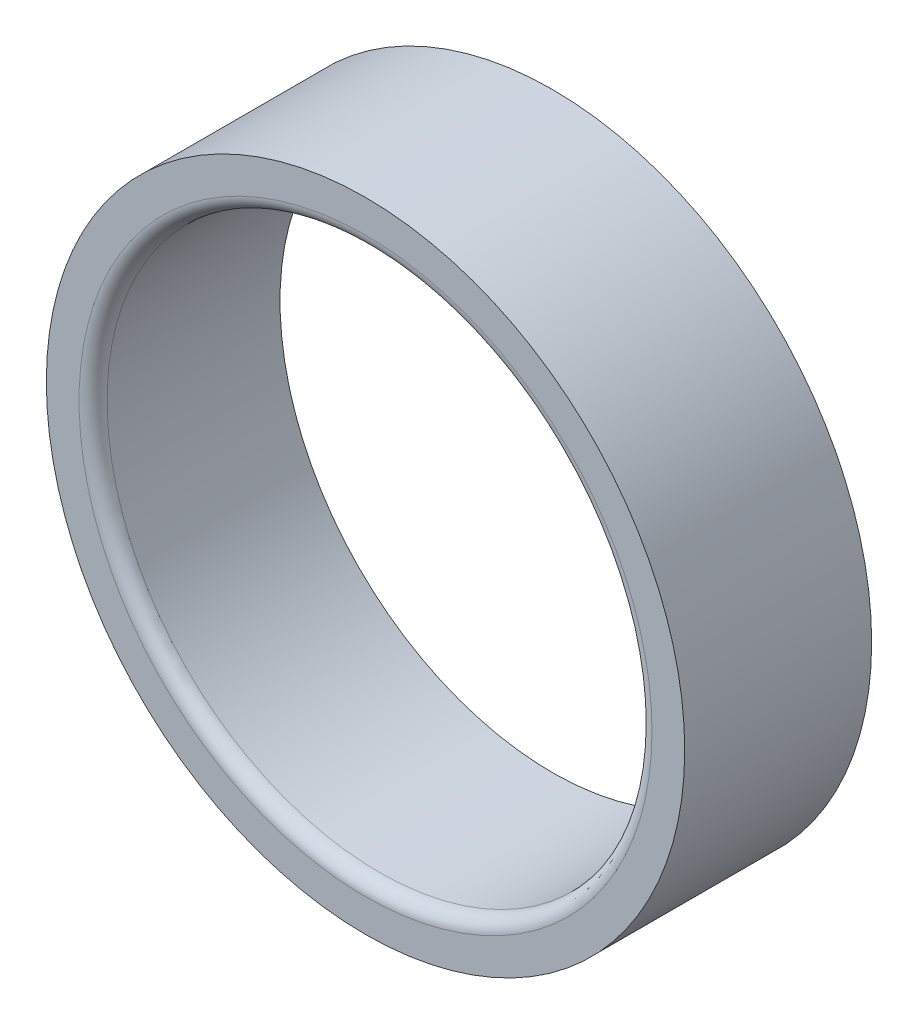
ISO-10303-21;
HEADER;
FILE_DESCRIPTION(('STEP AP214'),'2;1');
FILE_NAME('part.step','',(''),(''),'','','');
FILE_SCHEMA(('AUTOMOTIVE_DESIGN { 1 0 10303 214 1 1 1 1 }'));
ENDSEC;
DATA;
#1=APPLICATION_CONTEXT('core data for automotive mechanical design processes');
#2=APPLICATION_PROTOCOL_DEFINITION('international standard','automotive_design',2000,#1);
#3=PRODUCT_CONTEXT('',#1,'mechanical');
#4=PRODUCT('Part','Part','',(#3));
#5=PRODUCT_RELATED_PRODUCT_CATEGORY('part','',(#4));
#6=PRODUCT_DEFINITION_FORMATION('','',#4);
#7=PRODUCT_DEFINITION_CONTEXT('part definition',#1,'design');
#8=PRODUCT_DEFINITION('design','',#6,#7);
#9=PRODUCT_DEFINITION_SHAPE('','',#8);
#10=(LENGTH_UNIT() NAMED_UNIT(*) SI_UNIT(.MILLI.,.METRE.));
#11=(NAMED_UNIT(*) PLANE_ANGLE_UNIT() SI_UNIT($,.RADIAN.));
#12=(NAMED_UNIT(*) SI_UNIT($,.STERADIAN.) SOLID_ANGLE_UNIT());
#13=UNCERTAINTY_MEASURE_WITH_UNIT(LENGTH_MEASURE(1.E-05),#10,'distance_accuracy_value','');
#14=(GEOMETRIC_REPRESENTATION_CONTEXT(3) GLOBAL_UNCERTAINTY_ASSIGNED_CONTEXT((#13)) GLOBAL_UNIT_ASSIGNED_CONTEXT((#10,
#11,#12)) REPRESENTATION_CONTEXT('',''));
#15=CARTESIAN_POINT('',(0.,0.,0.));
#16=DIRECTION('',(0.,0.,1.));
#17=DIRECTION('',(1.,0.,0.));
#18=AXIS2_PLACEMENT_3D('',#15,#16,#17);
#19=CARTESIAN_POINT('',(0.,0.,20.));
#20=DIRECTION('',(0.,0.,1.));
#21=DIRECTION('',(1.,0.,0.));
#22=AXIS2_PLACEMENT_3D('',#19,#20,#21);
#23=PLANE('',#22);
#24=CARTESIAN_POINT('',(0.,0.,20.));
#25=DIRECTION('',(0.,0.,1.));
#26=DIRECTION('',(1.,0.,0.));
#27=AXIS2_PLACEMENT_3D('',#24,#25,#26);
#28=CIRCLE('',#27,30.65);
#29=CARTESIAN_POINT('',(30.65,0.,20.));
#30=VERTEX_POINT('',#29);
#31=EDGE_CURVE('E10',#30,#30,#28,.F.);
#32=ORIENTED_EDGE('',*,*,#31,.T.);
#33=EDGE_LOOP('',(#32));
#34=FACE_BOUND('',#33,.T.);
#35=CARTESIAN_POINT('',(0.,0.,20.));
#36=DIRECTION('',(0.,0.,1.));
#37=DIRECTION('',(1.,0.,0.));
#38=AXIS2_PLACEMENT_3D('',#35,#36,#37);
#39=CIRCLE('',#38,34.15);
#40=CARTESIAN_POINT('',(34.15,0.,20.));
#41=VERTEX_POINT('',#40);
#42=EDGE_CURVE('E42',#41,#41,#39,.T.);
#43=ORIENTED_EDGE('',*,*,#42,.T.);
#44=EDGE_LOOP('',(#43));
#45=FACE_BOUND('',#44,.T.);
#46=ADVANCED_FACE('F31',(#34,#45),#23,.T.);
#47=CARTESIAN_POINT('',(0.,0.,0.));
#48=DIRECTION('',(0.,0.,1.));
#49=DIRECTION('',(1.,0.,0.));
#50=AXIS2_PLACEMENT_3D('',#47,#48,#49);
#51=PLANE('',#50);
#52=CARTESIAN_POINT('',(0.,0.,0.));
#53=DIRECTION('',(0.,0.,1.));
#54=DIRECTION('',(1.,0.,0.));
#55=AXIS2_PLACEMENT_3D('',#52,#53,#54);
#56=CIRCLE('',#55,34.15);
#57=CARTESIAN_POINT('',(34.15,0.,0.));
#58=VERTEX_POINT('',#57);
#59=EDGE_CURVE('E46',#58,#58,#56,.T.);
#60=ORIENTED_EDGE('',*,*,#59,.F.);
#61=EDGE_LOOP('',(#60));
#62=FACE_BOUND('',#61,.T.);
#63=CARTESIAN_POINT('',(0.,0.,0.));
#64=DIRECTION('',(0.,0.,1.));
#65=DIRECTION('',(1.,0.,0.));
#66=AXIS2_PLACEMENT_3D('',#63,#64,#65);
#67=CIRCLE('',#66,29.15);
#68=CARTESIAN_POINT('',(29.15,0.,0.));
#69=VERTEX_POINT('',#68);
#70=EDGE_CURVE('E50',#69,#69,#67,.T.);
#71=ORIENTED_EDGE('',*,*,#70,.T.);
#72=EDGE_LOOP('',(#71));
#73=FACE_BOUND('',#72,.T.);
#74=ADVANCED_FACE('F55',(#62,#73),#51,.F.);
#75=CARTESIAN_POINT('',(0.,0.,20.));
#76=DIRECTION('',(0.,0.,-1.));
#77=DIRECTION('',(-1.,0.,0.));
#78=AXIS2_PLACEMENT_3D('',#75,#76,#77);
#79=CYLINDRICAL_SURFACE('',#78,34.15);
#80=ORIENTED_EDGE('',*,*,#42,.F.);
#81=EDGE_LOOP('',(#80));
#82=FACE_BOUND('',#81,.T.);
#83=ORIENTED_EDGE('',*,*,#59,.T.);
#84=EDGE_LOOP('',(#83));
#85=FACE_BOUND('',#84,.T.);
#86=ADVANCED_FACE('F59',(#82,#85),#79,.T.);
#87=CARTESIAN_POINT('',(0.,0.,20.));
#88=DIRECTION('',(0.,0.,-1.));
#89=DIRECTION('',(-1.,0.,0.));
#90=AXIS2_PLACEMENT_3D('',#87,#88,#89);
#91=CYLINDRICAL_SURFACE('',#90,29.15);
#92=CARTESIAN_POINT('',(0.,0.,18.5));
#93=DIRECTION('',(0.,0.,1.));
#94=DIRECTION('',(1.,0.,0.));
#95=AXIS2_PLACEMENT_3D('',#92,#93,#94);
#96=CIRCLE('',#95,29.15);
#97=CARTESIAN_POINT('',(29.15,0.,18.5));
#98=VERTEX_POINT('',#97);
#99=EDGE_CURVE('E38',#98,#98,#96,.T.);
#100=ORIENTED_EDGE('',*,*,#99,.T.);
#101=EDGE_LOOP('',(#100));
#102=FACE_BOUND('',#101,.T.);
#103=ORIENTED_EDGE('',*,*,#70,.F.);
#104=EDGE_LOOP('',(#103));
#105=FACE_BOUND('',#104,.T.);
#106=ADVANCED_FACE('F57',(#102,#105),#91,.F.);
#107=CARTESIAN_POINT('',(0.,0.,18.5));
#108=DIRECTION('',(0.,0.,1.));
#109=DIRECTION('',(1.,0.,0.));
#110=AXIS2_PLACEMENT_3D('',#107,#108,#109);
#111=TOROIDAL_SURFACE('',#110,30.65,1.5);
#112=ORIENTED_EDGE('',*,*,#31,.F.);
#113=EDGE_LOOP('',(#112));
#114=FACE_BOUND('',#113,.T.);
#115=ORIENTED_EDGE('',*,*,#99,.F.);
#116=EDGE_LOOP('',(#115));
#117=FACE_BOUND('',#116,.T.);
#118=ADVANCED_FACE('F33',(#114,#117),#111,.T.);
#119=CLOSED_SHELL('',(#46,#74,#86,#106,#118));
#120=MANIFOLD_SOLID_BREP('B2',#119);
#121=ADVANCED_BREP_SHAPE_REPRESENTATION('',(#18,#120),#14);
#122=SHAPE_DEFINITION_REPRESENTATION(#9,#121);
ENDSEC;
END-ISO-10303-21;
